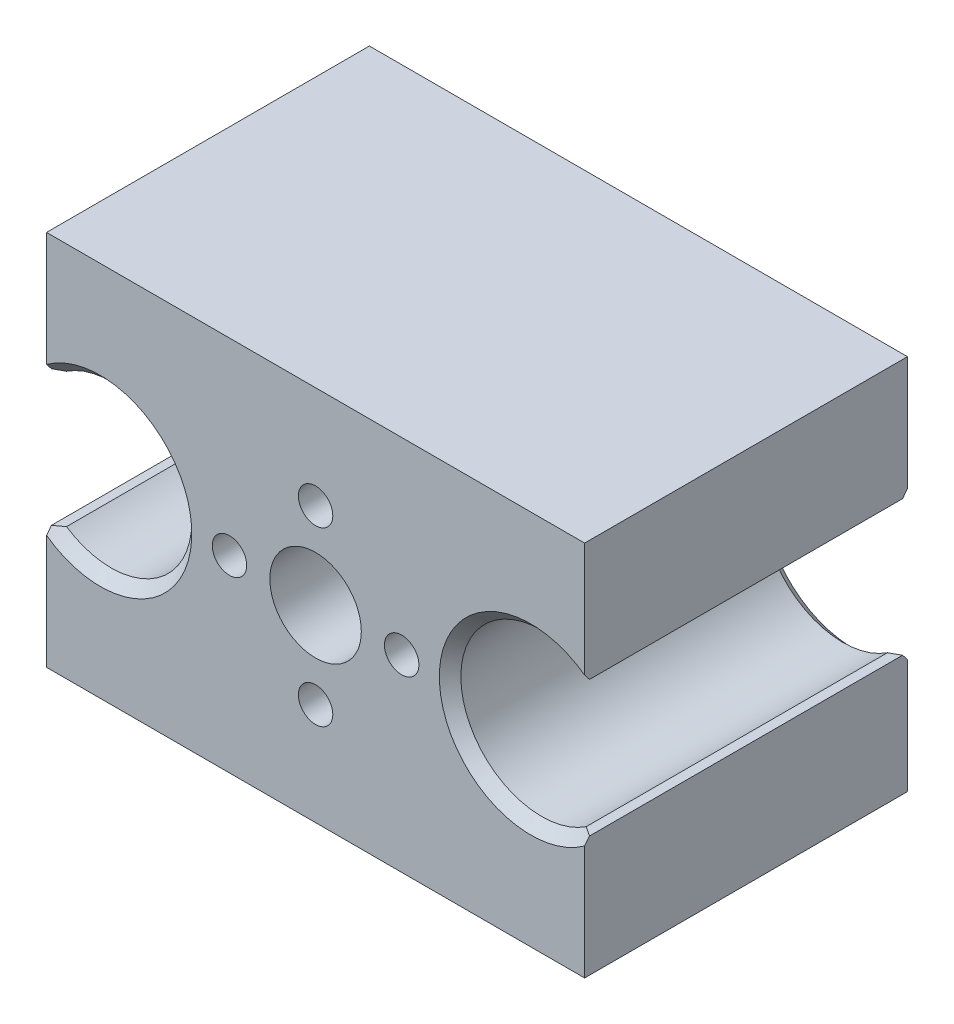
ISO-10303-21;
HEADER;
FILE_DESCRIPTION(('STEP AP214'),'2;1');
FILE_NAME('part.step','',(''),(''),'','','');
FILE_SCHEMA(('AUTOMOTIVE_DESIGN { 1 0 10303 214 1 1 1 1 }'));
ENDSEC;
DATA;
#1=APPLICATION_CONTEXT('core data for automotive mechanical design processes');
#2=APPLICATION_PROTOCOL_DEFINITION('international standard','automotive_design',2000,#1);
#3=PRODUCT_CONTEXT('',#1,'mechanical');
#4=PRODUCT('Part','Part','',(#3));
#5=PRODUCT_RELATED_PRODUCT_CATEGORY('part','',(#4));
#6=PRODUCT_DEFINITION_FORMATION('','',#4);
#7=PRODUCT_DEFINITION_CONTEXT('part definition',#1,'design');
#8=PRODUCT_DEFINITION('design','',#6,#7);
#9=PRODUCT_DEFINITION_SHAPE('','',#8);
#10=(LENGTH_UNIT() NAMED_UNIT(*) SI_UNIT(.MILLI.,.METRE.));
#11=(NAMED_UNIT(*) PLANE_ANGLE_UNIT() SI_UNIT($,.RADIAN.));
#12=(NAMED_UNIT(*) SI_UNIT($,.STERADIAN.) SOLID_ANGLE_UNIT());
#13=UNCERTAINTY_MEASURE_WITH_UNIT(LENGTH_MEASURE(1.E-05),#10,'distance_accuracy_value','');
#14=(GEOMETRIC_REPRESENTATION_CONTEXT(3) GLOBAL_UNCERTAINTY_ASSIGNED_CONTEXT((#13)) GLOBAL_UNIT_ASSIGNED_CONTEXT((#10,
#11,#12)) REPRESENTATION_CONTEXT('',''));
#15=CARTESIAN_POINT('',(0.,0.,0.));
#16=DIRECTION('',(0.,0.,1.));
#17=DIRECTION('',(1.,0.,0.));
#18=AXIS2_PLACEMENT_3D('',#15,#16,#17);
#19=CARTESIAN_POINT('',(25.,-17.5,30.));
#20=DIRECTION('',(-1.,0.,0.));
#21=DIRECTION('',(0.,0.,1.));
#22=AXIS2_PLACEMENT_3D('',#19,#20,#21);
#23=PLANE('',#22);
#24=DIRECTION('',(0.,0.,1.));
#25=VECTOR('',#24,1.);
#26=CARTESIAN_POINT('',(25.,-6.29837387624891,30.));
#27=LINE('',#26,#25);
#28=CARTESIAN_POINT('',(25.,-6.29837387624891,0.458264274112555));
#29=VERTEX_POINT('',#28);
#30=CARTESIAN_POINT('',(25.,-6.29837387624891,29.5417357258874));
#31=VERTEX_POINT('',#30);
#32=EDGE_CURVE('E178',#29,#31,#27,.T.);
#33=ORIENTED_EDGE('',*,*,#32,.T.);
#34=CARTESIAN_POINT('',(25.,-6.29837387624891,29.5417357258874));
#35=CARTESIAN_POINT('',(25.,-6.39488385614054,29.6173659402342));
#36=CARTESIAN_POINT('',(25.,-6.49109633830478,29.6933697531287));
#37=CARTESIAN_POINT('',(25.,-6.6829262265328,29.8461245117944));
#38=CARTESIAN_POINT('',(25.,-6.77854363309685,29.9228754569375));
#39=CARTESIAN_POINT('',(25.,-6.8738635424338,30.));
#40=B_SPLINE_CURVE_WITH_KNOTS('',3,(#34,#35,#36,#37,#38,#39),.UNSPECIFIED.,.F.,.F.,(4,2,4),(0.,
0.367832559309629,0.735664809344251),.UNSPECIFIED.);
#41=CARTESIAN_POINT('',(25.,-6.8738635424338,30.));
#42=VERTEX_POINT('',#41);
#43=EDGE_CURVE('E209',#31,#42,#40,.T.);
#44=ORIENTED_EDGE('',*,*,#43,.T.);
#45=DIRECTION('',(0.,1.,0.));
#46=VECTOR('',#45,1.);
#47=CARTESIAN_POINT('',(25.,-17.5,30.));
#48=LINE('',#47,#46);
#49=CARTESIAN_POINT('',(25.,-17.5,30.));
#50=VERTEX_POINT('',#49);
#51=EDGE_CURVE('E160',#50,#42,#48,.T.);
#52=ORIENTED_EDGE('',*,*,#51,.F.);
#53=DIRECTION('',(0.,0.,-1.));
#54=VECTOR('',#53,1.);
#55=CARTESIAN_POINT('',(25.,-17.5,30.));
#56=LINE('',#55,#54);
#57=CARTESIAN_POINT('',(25.,-17.5,0.));
#58=VERTEX_POINT('',#57);
#59=EDGE_CURVE('E421',#50,#58,#56,.T.);
#60=ORIENTED_EDGE('',*,*,#59,.T.);
#61=DIRECTION('',(0.,1.,0.));
#62=VECTOR('',#61,1.);
#63=CARTESIAN_POINT('',(25.,-17.5,0.));
#64=LINE('',#63,#62);
#65=CARTESIAN_POINT('',(25.,-6.87386354243378,0.));
#66=VERTEX_POINT('',#65);
#67=EDGE_CURVE('E424',#58,#66,#64,.T.);
#68=ORIENTED_EDGE('',*,*,#67,.T.);
#69=CARTESIAN_POINT('',(25.,-6.87386354243378,0.));
#70=CARTESIAN_POINT('',(25.,-6.77854363309684,0.0771245430624894));
#71=CARTESIAN_POINT('',(25.,-6.68292622653279,0.153875488205571));
#72=CARTESIAN_POINT('',(25.,-6.49109633830477,0.306630246871336));
#73=CARTESIAN_POINT('',(25.,-6.39488385614054,0.382634059765773));
#74=CARTESIAN_POINT('',(25.,-6.29837387624891,0.458264274112556));
#75=B_SPLINE_CURVE_WITH_KNOTS('',3,(#69,#70,#71,#72,#73,#74),.UNSPECIFIED.,.F.,.F.,(4,2,4),(0.,
0.367832250034613,0.735664809344231),.UNSPECIFIED.);
#76=EDGE_CURVE('E176',#66,#29,#75,.T.);
#77=ORIENTED_EDGE('',*,*,#76,.T.);
#78=EDGE_LOOP('',(#33,#44,#52,#60,#68,#77));
#79=FACE_BOUND('',#78,.T.);
#80=ADVANCED_FACE('F37',(#79),#23,.F.);
#81=CARTESIAN_POINT('',(0.,0.,30.));
#82=DIRECTION('',(0.,0.,-1.));
#83=DIRECTION('',(-1.,0.,0.));
#84=AXIS2_PLACEMENT_3D('',#81,#82,#83);
#85=PLANE('',#84);
#86=CARTESIAN_POINT('',(0.,0.,30.));
#87=DIRECTION('',(0.,0.,1.));
#88=DIRECTION('',(1.,0.,0.));
#89=AXIS2_PLACEMENT_3D('',#86,#87,#88);
#90=CIRCLE('',#89,4.25000000000001);
#91=CARTESIAN_POINT('',(4.25000000000001,0.,30.));
#92=VERTEX_POINT('',#91);
#93=EDGE_CURVE('E442',#92,#92,#90,.T.);
#94=ORIENTED_EDGE('',*,*,#93,.F.);
#95=EDGE_LOOP('',(#94));
#96=FACE_BOUND('',#95,.T.);
#97=CARTESIAN_POINT('',(0.,-8.,30.));
#98=DIRECTION('',(0.,0.,1.));
#99=DIRECTION('',(1.,0.,0.));
#100=AXIS2_PLACEMENT_3D('',#97,#98,#99);
#101=CIRCLE('',#100,1.60000000000001);
#102=CARTESIAN_POINT('',(1.60000000000001,-8.,30.));
#103=VERTEX_POINT('',#102);
#104=EDGE_CURVE('E449',#103,#103,#101,.T.);
#105=ORIENTED_EDGE('',*,*,#104,.F.);
#106=EDGE_LOOP('',(#105));
#107=FACE_BOUND('',#106,.T.);
#108=CARTESIAN_POINT('',(-8.,0.,30.));
#109=DIRECTION('',(0.,0.,1.));
#110=DIRECTION('',(1.,0.,0.));
#111=AXIS2_PLACEMENT_3D('',#108,#109,#110);
#112=CIRCLE('',#111,1.60000000000001);
#113=CARTESIAN_POINT('',(-6.39999999999999,0.,30.));
#114=VERTEX_POINT('',#113);
#115=EDGE_CURVE('E457',#114,#114,#112,.T.);
#116=ORIENTED_EDGE('',*,*,#115,.F.);
#117=EDGE_LOOP('',(#116));
#118=FACE_BOUND('',#117,.T.);
#119=CARTESIAN_POINT('',(0.,8.,30.));
#120=DIRECTION('',(0.,0.,1.));
#121=DIRECTION('',(1.,0.,0.));
#122=AXIS2_PLACEMENT_3D('',#119,#120,#121);
#123=CIRCLE('',#122,1.60000000000001);
#124=CARTESIAN_POINT('',(1.60000000000001,8.,30.));
#125=VERTEX_POINT('',#124);
#126=EDGE_CURVE('E463',#125,#125,#123,.T.);
#127=ORIENTED_EDGE('',*,*,#126,.F.);
#128=EDGE_LOOP('',(#127));
#129=FACE_BOUND('',#128,.T.);
#130=CARTESIAN_POINT('',(8.,0.,30.));
#131=DIRECTION('',(0.,0.,1.));
#132=DIRECTION('',(1.,0.,0.));
#133=AXIS2_PLACEMENT_3D('',#130,#131,#132);
#134=CIRCLE('',#133,1.60000000000001);
#135=CARTESIAN_POINT('',(9.60000000000002,0.,30.));
#136=VERTEX_POINT('',#135);
#137=EDGE_CURVE('E440',#136,#136,#134,.T.);
#138=ORIENTED_EDGE('',*,*,#137,.F.);
#139=EDGE_LOOP('',(#138));
#140=FACE_BOUND('',#139,.T.);
#141=ORIENTED_EDGE('',*,*,#51,.T.);
#142=CARTESIAN_POINT('',(20.,0.,30.));
#143=DIRECTION('',(0.,0.,-1.));
#144=DIRECTION('',(-1.,0.,0.));
#145=AXIS2_PLACEMENT_3D('',#142,#143,#144);
#146=CIRCLE('',#145,8.50000000000003);
#147=CARTESIAN_POINT('',(25.,6.8738635424338,30.));
#148=VERTEX_POINT('',#147);
#149=EDGE_CURVE('E156',#42,#148,#146,.T.);
#150=ORIENTED_EDGE('',*,*,#149,.T.);
#151=CARTESIAN_POINT('',(25.,17.5,30.));
#152=VERTEX_POINT('',#151);
#153=EDGE_CURVE('E148',#148,#152,#48,.T.);
#154=ORIENTED_EDGE('',*,*,#153,.T.);
#155=DIRECTION('',(-1.,0.,0.));
#156=VECTOR('',#155,1.);
#157=CARTESIAN_POINT('',(-25.,17.5,30.));
#158=LINE('',#157,#156);
#159=CARTESIAN_POINT('',(-25.,17.5,30.));
#160=VERTEX_POINT('',#159);
#161=EDGE_CURVE('E153',#152,#160,#158,.T.);
#162=ORIENTED_EDGE('',*,*,#161,.T.);
#163=DIRECTION('',(0.,-1.,0.));
#164=VECTOR('',#163,1.);
#165=CARTESIAN_POINT('',(-25.,-17.5,30.));
#166=LINE('',#165,#164);
#167=CARTESIAN_POINT('',(-25.,6.8738635424338,30.));
#168=VERTEX_POINT('',#167);
#169=EDGE_CURVE('E394',#160,#168,#166,.T.);
#170=ORIENTED_EDGE('',*,*,#169,.T.);
#171=CARTESIAN_POINT('',(-20.,0.,30.));
#172=DIRECTION('',(0.,0.,-1.));
#173=DIRECTION('',(-1.,0.,0.));
#174=AXIS2_PLACEMENT_3D('',#171,#172,#173);
#175=CIRCLE('',#174,8.50000000000003);
#176=CARTESIAN_POINT('',(-25.,-6.8738635424338,30.));
#177=VERTEX_POINT('',#176);
#178=EDGE_CURVE('E390',#168,#177,#175,.T.);
#179=ORIENTED_EDGE('',*,*,#178,.T.);
#180=CARTESIAN_POINT('',(-25.,-17.5,30.));
#181=VERTEX_POINT('',#180);
#182=EDGE_CURVE('E170',#177,#181,#166,.T.);
#183=ORIENTED_EDGE('',*,*,#182,.T.);
#184=DIRECTION('',(1.,0.,0.));
#185=VECTOR('',#184,1.);
#186=CARTESIAN_POINT('',(-25.,-17.5,30.));
#187=LINE('',#186,#185);
#188=EDGE_CURVE('E420',#181,#50,#187,.T.);
#189=ORIENTED_EDGE('',*,*,#188,.T.);
#190=EDGE_LOOP('',(#141,#150,#154,#162,#170,#179,#183,#189));
#191=FACE_BOUND('',#190,.T.);
#192=ADVANCED_FACE('F151',(#96,#107,#118,#129,#140,#191),#85,.F.);
#193=CARTESIAN_POINT('',(0.,0.,0.));
#194=DIRECTION('',(0.,0.,-1.));
#195=DIRECTION('',(-1.,0.,0.));
#196=AXIS2_PLACEMENT_3D('',#193,#194,#195);
#197=PLANE('',#196);
#198=CARTESIAN_POINT('',(0.,0.,0.));
#199=DIRECTION('',(0.,0.,-1.));
#200=DIRECTION('',(-1.,0.,0.));
#201=AXIS2_PLACEMENT_3D('',#198,#199,#200);
#202=CIRCLE('',#201,5.25000000000001);
#203=CARTESIAN_POINT('',(-5.25000000000001,0.,0.));
#204=VERTEX_POINT('',#203);
#205=EDGE_CURVE('E474',#204,#204,#202,.T.);
#206=ORIENTED_EDGE('',*,*,#205,.F.);
#207=EDGE_LOOP('',(#206));
#208=FACE_BOUND('',#207,.T.);
#209=CARTESIAN_POINT('',(8.,0.,0.));
#210=DIRECTION('',(0.,0.,1.));
#211=DIRECTION('',(1.,0.,0.));
#212=AXIS2_PLACEMENT_3D('',#209,#210,#211);
#213=CIRCLE('',#212,1.60000000000001);
#214=CARTESIAN_POINT('',(9.60000000000001,0.,0.));
#215=VERTEX_POINT('',#214);
#216=EDGE_CURVE('E466',#215,#215,#213,.T.);
#217=ORIENTED_EDGE('',*,*,#216,.T.);
#218=EDGE_LOOP('',(#217));
#219=FACE_BOUND('',#218,.T.);
#220=CARTESIAN_POINT('',(0.,8.,0.));
#221=DIRECTION('',(0.,0.,1.));
#222=DIRECTION('',(1.,0.,0.));
#223=AXIS2_PLACEMENT_3D('',#220,#221,#222);
#224=CIRCLE('',#223,1.60000000000001);
#225=CARTESIAN_POINT('',(1.60000000000001,8.,0.));
#226=VERTEX_POINT('',#225);
#227=EDGE_CURVE('E460',#226,#226,#224,.T.);
#228=ORIENTED_EDGE('',*,*,#227,.T.);
#229=EDGE_LOOP('',(#228));
#230=FACE_BOUND('',#229,.T.);
#231=CARTESIAN_POINT('',(-8.,0.,0.));
#232=DIRECTION('',(0.,0.,1.));
#233=DIRECTION('',(1.,0.,0.));
#234=AXIS2_PLACEMENT_3D('',#231,#232,#233);
#235=CIRCLE('',#234,1.60000000000001);
#236=CARTESIAN_POINT('',(-6.39999999999999,0.,0.));
#237=VERTEX_POINT('',#236);
#238=EDGE_CURVE('E454',#237,#237,#235,.T.);
#239=ORIENTED_EDGE('',*,*,#238,.T.);
#240=EDGE_LOOP('',(#239));
#241=FACE_BOUND('',#240,.T.);
#242=CARTESIAN_POINT('',(0.,-8.,0.));
#243=DIRECTION('',(0.,0.,1.));
#244=DIRECTION('',(1.,0.,0.));
#245=AXIS2_PLACEMENT_3D('',#242,#243,#244);
#246=CIRCLE('',#245,1.60000000000001);
#247=CARTESIAN_POINT('',(1.60000000000001,-8.,0.));
#248=VERTEX_POINT('',#247);
#249=EDGE_CURVE('E444',#248,#248,#246,.T.);
#250=ORIENTED_EDGE('',*,*,#249,.T.);
#251=EDGE_LOOP('',(#250));
#252=FACE_BOUND('',#251,.T.);
#253=CARTESIAN_POINT('',(25.,6.87386354243378,0.));
#254=VERTEX_POINT('',#253);
#255=CARTESIAN_POINT('',(25.,17.5,0.));
#256=VERTEX_POINT('',#255);
#257=EDGE_CURVE('E174',#254,#256,#64,.T.);
#258=ORIENTED_EDGE('',*,*,#257,.F.);
#259=CARTESIAN_POINT('',(20.,0.,0.));
#260=DIRECTION('',(0.,0.,-1.));
#261=DIRECTION('',(-1.,0.,0.));
#262=AXIS2_PLACEMENT_3D('',#259,#260,#261);
#263=CIRCLE('',#262,8.50000000000002);
#264=EDGE_CURVE('E234',#254,#66,#263,.F.);
#265=ORIENTED_EDGE('',*,*,#264,.T.);
#266=ORIENTED_EDGE('',*,*,#67,.F.);
#267=DIRECTION('',(1.,0.,0.));
#268=VECTOR('',#267,1.);
#269=CARTESIAN_POINT('',(-25.,-17.5,0.));
#270=LINE('',#269,#268);
#271=CARTESIAN_POINT('',(-25.,-17.5,0.));
#272=VERTEX_POINT('',#271);
#273=EDGE_CURVE('E161',#272,#58,#270,.T.);
#274=ORIENTED_EDGE('',*,*,#273,.F.);
#275=DIRECTION('',(0.,-1.,0.));
#276=VECTOR('',#275,1.);
#277=CARTESIAN_POINT('',(-25.,-17.5,0.));
#278=LINE('',#277,#276);
#279=CARTESIAN_POINT('',(-25.,-6.87386354243378,0.));
#280=VERTEX_POINT('',#279);
#281=EDGE_CURVE('E407',#280,#272,#278,.T.);
#282=ORIENTED_EDGE('',*,*,#281,.F.);
#283=CARTESIAN_POINT('',(-20.,0.,0.));
#284=DIRECTION('',(0.,0.,-1.));
#285=DIRECTION('',(-1.,0.,0.));
#286=AXIS2_PLACEMENT_3D('',#283,#284,#285);
#287=CIRCLE('',#286,8.50000000000002);
#288=CARTESIAN_POINT('',(-25.,6.87386354243378,0.));
#289=VERTEX_POINT('',#288);
#290=EDGE_CURVE('E231',#280,#289,#287,.F.);
#291=ORIENTED_EDGE('',*,*,#290,.T.);
#292=CARTESIAN_POINT('',(-25.,17.5,0.));
#293=VERTEX_POINT('',#292);
#294=EDGE_CURVE('E413',#293,#289,#278,.T.);
#295=ORIENTED_EDGE('',*,*,#294,.F.);
#296=DIRECTION('',(-1.,0.,0.));
#297=VECTOR('',#296,1.);
#298=CARTESIAN_POINT('',(-25.,17.5,0.));
#299=LINE('',#298,#297);
#300=EDGE_CURVE('E414',#256,#293,#299,.T.);
#301=ORIENTED_EDGE('',*,*,#300,.F.);
#302=EDGE_LOOP('',(#258,#265,#266,#274,#282,#291,#295,#301));
#303=FACE_BOUND('',#302,.T.);
#304=ADVANCED_FACE('F373',(#208,#219,#230,#241,#252,#303),#197,.T.);
#305=CARTESIAN_POINT('',(-25.,-17.5,30.));
#306=DIRECTION('',(1.,0.,0.));
#307=DIRECTION('',(0.,0.,-1.));
#308=AXIS2_PLACEMENT_3D('',#305,#306,#307);
#309=PLANE('',#308);
#310=ORIENTED_EDGE('',*,*,#294,.T.);
#311=CARTESIAN_POINT('',(-25.,6.87386354243378,0.));
#312=CARTESIAN_POINT('',(-25.,6.77854363309684,0.0771245430624881));
#313=CARTESIAN_POINT('',(-25.,6.68292622653279,0.153875488205569));
#314=CARTESIAN_POINT('',(-25.,6.49109633830477,0.306630246871331));
#315=CARTESIAN_POINT('',(-25.,6.39488385614054,0.382634059765766));
#316=CARTESIAN_POINT('',(-25.,6.29837387624891,0.458264274112548));
#317=B_SPLINE_CURVE_WITH_KNOTS('',3,(#311,#312,#313,#314,#315,#316),.UNSPECIFIED.,.F.,.F.,(4,2,
4),(0.,0.36783225003461,0.735664809344226),.UNSPECIFIED.);
#318=CARTESIAN_POINT('',(-25.,6.29837387624891,0.458264274112549));
#319=VERTEX_POINT('',#318);
#320=EDGE_CURVE('E11',#289,#319,#317,.T.);
#321=ORIENTED_EDGE('',*,*,#320,.T.);
#322=DIRECTION('',(0.,0.,1.));
#323=VECTOR('',#322,1.);
#324=CARTESIAN_POINT('',(-25.,6.29837387624891,30.));
#325=LINE('',#324,#323);
#326=CARTESIAN_POINT('',(-25.,6.29837387624891,29.5417357258874));
#327=VERTEX_POINT('',#326);
#328=EDGE_CURVE('E48',#319,#327,#325,.T.);
#329=ORIENTED_EDGE('',*,*,#328,.T.);
#330=CARTESIAN_POINT('',(-25.,6.29837387624891,29.5417357258874));
#331=CARTESIAN_POINT('',(-25.,6.39488385614054,29.6173659402342));
#332=CARTESIAN_POINT('',(-25.,6.49109633830478,29.6933697531287));
#333=CARTESIAN_POINT('',(-25.,6.6829262265328,29.8461245117944));
#334=CARTESIAN_POINT('',(-25.,6.77854363309685,29.9228754569375));
#335=CARTESIAN_POINT('',(-25.,6.8738635424338,30.));
#336=B_SPLINE_CURVE_WITH_KNOTS('',3,(#330,#331,#332,#333,#334,#335),.UNSPECIFIED.,.F.,.F.,(4,2,
4),(0.,0.367832559309628,0.735664809344249),.UNSPECIFIED.);
#337=EDGE_CURVE('E270',#327,#168,#336,.T.);
#338=ORIENTED_EDGE('',*,*,#337,.T.);
#339=ORIENTED_EDGE('',*,*,#169,.F.);
#340=DIRECTION('',(0.,0.,-1.));
#341=VECTOR('',#340,1.);
#342=CARTESIAN_POINT('',(-25.,17.5,30.));
#343=LINE('',#342,#341);
#344=EDGE_CURVE('E168',#160,#293,#343,.T.);
#345=ORIENTED_EDGE('',*,*,#344,.T.);
#346=EDGE_LOOP('',(#310,#321,#329,#338,#339,#345));
#347=FACE_BOUND('',#346,.T.);
#348=ADVANCED_FACE('F200',(#347),#309,.F.);
#349=ORIENTED_EDGE('',*,*,#153,.F.);
#350=CARTESIAN_POINT('',(25.,6.8738635424338,30.));
#351=CARTESIAN_POINT('',(25.,6.77854363309685,29.9228754569375));
#352=CARTESIAN_POINT('',(25.,6.6829262265328,29.8461245117944));
#353=CARTESIAN_POINT('',(25.,6.49109633830478,29.6933697531287));
#354=CARTESIAN_POINT('',(25.,6.39488385614054,29.6173659402342));
#355=CARTESIAN_POINT('',(25.,6.29837387624891,29.5417357258874));
#356=B_SPLINE_CURVE_WITH_KNOTS('',3,(#350,#351,#352,#353,#354,#355),.UNSPECIFIED.,.F.,.F.,(4,2,
4),(0.,0.367832250034623,0.73566480934425),.UNSPECIFIED.);
#357=CARTESIAN_POINT('',(25.,6.29837387624891,29.5417357258874));
#358=VERTEX_POINT('',#357);
#359=EDGE_CURVE('E225',#148,#358,#356,.T.);
#360=ORIENTED_EDGE('',*,*,#359,.T.);
#361=DIRECTION('',(0.,0.,-1.));
#362=VECTOR('',#361,1.);
#363=CARTESIAN_POINT('',(25.,6.29837387624891,30.));
#364=LINE('',#363,#362);
#365=CARTESIAN_POINT('',(25.,6.29837387624891,0.458264274112555));
#366=VERTEX_POINT('',#365);
#367=EDGE_CURVE('E223',#358,#366,#364,.T.);
#368=ORIENTED_EDGE('',*,*,#367,.T.);
#369=CARTESIAN_POINT('',(25.,6.29837387624891,0.458264274112555));
#370=CARTESIAN_POINT('',(25.,6.39488385614054,0.382634059765772));
#371=CARTESIAN_POINT('',(25.,6.49109633830477,0.306630246871336));
#372=CARTESIAN_POINT('',(25.,6.68292622653279,0.153875488205572));
#373=CARTESIAN_POINT('',(25.,6.77854363309684,0.0771245430624909));
#374=CARTESIAN_POINT('',(25.,6.87386354243378,0.));
#375=B_SPLINE_CURVE_WITH_KNOTS('',3,(#369,#370,#371,#372,#373,#374),.UNSPECIFIED.,.F.,.F.,(4,2,
4),(0.,0.367832559309616,0.735664809344228),.UNSPECIFIED.);
#376=EDGE_CURVE('E216',#366,#254,#375,.T.);
#377=ORIENTED_EDGE('',*,*,#376,.T.);
#378=ORIENTED_EDGE('',*,*,#257,.T.);
#379=DIRECTION('',(0.,0.,-1.));
#380=VECTOR('',#379,1.);
#381=CARTESIAN_POINT('',(25.,17.5,30.));
#382=LINE('',#381,#380);
#383=EDGE_CURVE('E166',#152,#256,#382,.T.);
#384=ORIENTED_EDGE('',*,*,#383,.F.);
#385=EDGE_LOOP('',(#349,#360,#368,#377,#378,#384));
#386=FACE_BOUND('',#385,.T.);
#387=ADVANCED_FACE('F172',(#386),#23,.F.);
#388=CARTESIAN_POINT('',(-25.,17.5,30.));
#389=DIRECTION('',(0.,-1.,0.));
#390=DIRECTION('',(0.,0.,-1.));
#391=AXIS2_PLACEMENT_3D('',#388,#389,#390);
#392=PLANE('',#391);
#393=ORIENTED_EDGE('',*,*,#300,.T.);
#394=ORIENTED_EDGE('',*,*,#344,.F.);
#395=ORIENTED_EDGE('',*,*,#161,.F.);
#396=ORIENTED_EDGE('',*,*,#383,.T.);
#397=EDGE_LOOP('',(#393,#394,#395,#396));
#398=FACE_BOUND('',#397,.T.);
#399=ADVANCED_FACE('F165',(#398),#392,.F.);
#400=DIRECTION('',(0.,0.,-1.));
#401=VECTOR('',#400,1.);
#402=CARTESIAN_POINT('',(-25.,-6.29837387624891,30.));
#403=LINE('',#402,#401);
#404=CARTESIAN_POINT('',(-25.,-6.29837387624891,29.5417357258874));
#405=VERTEX_POINT('',#404);
#406=CARTESIAN_POINT('',(-25.,-6.29837387624891,0.458264274112549));
#407=VERTEX_POINT('',#406);
#408=EDGE_CURVE('E251',#405,#407,#403,.T.);
#409=ORIENTED_EDGE('',*,*,#408,.T.);
#410=CARTESIAN_POINT('',(-25.,-6.29837387624891,0.458264274112549));
#411=CARTESIAN_POINT('',(-25.,-6.39488385614054,0.382634059765766));
#412=CARTESIAN_POINT('',(-25.,-6.49109633830477,0.30663024687133));
#413=CARTESIAN_POINT('',(-25.,-6.68292622653279,0.153875488205569));
#414=CARTESIAN_POINT('',(-25.,-6.77854363309684,0.0771245430624885));
#415=CARTESIAN_POINT('',(-25.,-6.87386354243378,0.));
#416=B_SPLINE_CURVE_WITH_KNOTS('',3,(#410,#411,#412,#413,#414,#415),.UNSPECIFIED.,.F.,.F.,(4,2,
4),(0.,0.367832559309616,0.735664809344226),.UNSPECIFIED.);
#417=EDGE_CURVE('E263',#407,#280,#416,.T.);
#418=ORIENTED_EDGE('',*,*,#417,.T.);
#419=ORIENTED_EDGE('',*,*,#281,.T.);
#420=DIRECTION('',(0.,0.,-1.));
#421=VECTOR('',#420,1.);
#422=CARTESIAN_POINT('',(-25.,-17.5,30.));
#423=LINE('',#422,#421);
#424=EDGE_CURVE('E180',#181,#272,#423,.T.);
#425=ORIENTED_EDGE('',*,*,#424,.F.);
#426=ORIENTED_EDGE('',*,*,#182,.F.);
#427=CARTESIAN_POINT('',(-25.,-6.8738635424338,30.));
#428=CARTESIAN_POINT('',(-25.,-6.77854363309685,29.9228754569375));
#429=CARTESIAN_POINT('',(-25.,-6.6829262265328,29.8461245117944));
#430=CARTESIAN_POINT('',(-25.,-6.49109633830478,29.6933697531287));
#431=CARTESIAN_POINT('',(-25.,-6.39488385614054,29.6173659402342));
#432=CARTESIAN_POINT('',(-25.,-6.29837387624891,29.5417357258874));
#433=B_SPLINE_CURVE_WITH_KNOTS('',3,(#427,#428,#429,#430,#431,#432),.UNSPECIFIED.,.F.,.F.,(4,2,
4),(0.,0.367832250034623,0.73566480934425),.UNSPECIFIED.);
#434=EDGE_CURVE('E245',#177,#405,#433,.T.);
#435=ORIENTED_EDGE('',*,*,#434,.T.);
#436=EDGE_LOOP('',(#409,#418,#419,#425,#426,#435));
#437=FACE_BOUND('',#436,.T.);
#438=ADVANCED_FACE('F253',(#437),#309,.F.);
#439=CARTESIAN_POINT('',(-25.,-17.5,30.));
#440=DIRECTION('',(0.,1.,0.));
#441=DIRECTION('',(0.,0.,1.));
#442=AXIS2_PLACEMENT_3D('',#439,#440,#441);
#443=PLANE('',#442);
#444=ORIENTED_EDGE('',*,*,#273,.T.);
#445=ORIENTED_EDGE('',*,*,#59,.F.);
#446=ORIENTED_EDGE('',*,*,#188,.F.);
#447=ORIENTED_EDGE('',*,*,#424,.T.);
#448=EDGE_LOOP('',(#444,#445,#446,#447));
#449=FACE_BOUND('',#448,.T.);
#450=ADVANCED_FACE('F257',(#449),#443,.F.);
#451=CARTESIAN_POINT('',(0.,0.,30.));
#452=DIRECTION('',(0.,0.,1.));
#453=DIRECTION('',(1.,0.,0.));
#454=AXIS2_PLACEMENT_3D('',#451,#452,#453);
#455=CYLINDRICAL_SURFACE('',#454,4.25000000000001);
#456=CARTESIAN_POINT('',(0.,0.,12.));
#457=DIRECTION('',(0.,0.,1.));
#458=DIRECTION('',(1.,0.,0.));
#459=AXIS2_PLACEMENT_3D('',#456,#457,#458);
#460=CIRCLE('',#459,4.25000000000001);
#461=CARTESIAN_POINT('',(4.25000000000001,0.,12.));
#462=VERTEX_POINT('',#461);
#463=EDGE_CURVE('E43',#462,#462,#460,.F.);
#464=ORIENTED_EDGE('',*,*,#463,.T.);
#465=EDGE_LOOP('',(#464));
#466=FACE_BOUND('',#465,.T.);
#467=ORIENTED_EDGE('',*,*,#93,.T.);
#468=EDGE_LOOP('',(#467));
#469=FACE_BOUND('',#468,.T.);
#470=ADVANCED_FACE('F494',(#466,#469),#455,.F.);
#471=CARTESIAN_POINT('',(0.,-8.,30.));
#472=DIRECTION('',(0.,0.,1.));
#473=DIRECTION('',(1.,0.,0.));
#474=AXIS2_PLACEMENT_3D('',#471,#472,#473);
#475=CYLINDRICAL_SURFACE('',#474,1.60000000000001);
#476=ORIENTED_EDGE('',*,*,#249,.F.);
#477=EDGE_LOOP('',(#476));
#478=FACE_BOUND('',#477,.T.);
#479=ORIENTED_EDGE('',*,*,#104,.T.);
#480=EDGE_LOOP('',(#479));
#481=FACE_BOUND('',#480,.T.);
#482=ADVANCED_FACE('F490',(#478,#481),#475,.F.);
#483=CARTESIAN_POINT('',(-8.,0.,30.));
#484=DIRECTION('',(0.,0.,1.));
#485=DIRECTION('',(1.,0.,0.));
#486=AXIS2_PLACEMENT_3D('',#483,#484,#485);
#487=CYLINDRICAL_SURFACE('',#486,1.60000000000001);
#488=ORIENTED_EDGE('',*,*,#238,.F.);
#489=EDGE_LOOP('',(#488));
#490=FACE_BOUND('',#489,.T.);
#491=ORIENTED_EDGE('',*,*,#115,.T.);
#492=EDGE_LOOP('',(#491));
#493=FACE_BOUND('',#492,.T.);
#494=ADVANCED_FACE('F493',(#490,#493),#487,.F.);
#495=CARTESIAN_POINT('',(0.,8.,30.));
#496=DIRECTION('',(0.,0.,1.));
#497=DIRECTION('',(1.,0.,0.));
#498=AXIS2_PLACEMENT_3D('',#495,#496,#497);
#499=CYLINDRICAL_SURFACE('',#498,1.60000000000001);
#500=ORIENTED_EDGE('',*,*,#227,.F.);
#501=EDGE_LOOP('',(#500));
#502=FACE_BOUND('',#501,.T.);
#503=ORIENTED_EDGE('',*,*,#126,.T.);
#504=EDGE_LOOP('',(#503));
#505=FACE_BOUND('',#504,.T.);
#506=ADVANCED_FACE('F507',(#502,#505),#499,.F.);
#507=CARTESIAN_POINT('',(8.,0.,30.));
#508=DIRECTION('',(0.,0.,1.));
#509=DIRECTION('',(1.,0.,0.));
#510=AXIS2_PLACEMENT_3D('',#507,#508,#509);
#511=CYLINDRICAL_SURFACE('',#510,1.60000000000001);
#512=ORIENTED_EDGE('',*,*,#216,.F.);
#513=EDGE_LOOP('',(#512));
#514=FACE_BOUND('',#513,.T.);
#515=ORIENTED_EDGE('',*,*,#137,.T.);
#516=EDGE_LOOP('',(#515));
#517=FACE_BOUND('',#516,.T.);
#518=ADVANCED_FACE('F505',(#514,#517),#511,.F.);
#519=CARTESIAN_POINT('',(-20.,0.,30.));
#520=DIRECTION('',(0.,0.,1.));
#521=DIRECTION('',(1.,0.,0.));
#522=AXIS2_PLACEMENT_3D('',#519,#520,#521);
#523=CYLINDRICAL_SURFACE('',#522,7.50000000000001);
#524=DIRECTION('',(0.,0.,1.));
#525=VECTOR('',#524,1.);
#526=CARTESIAN_POINT('',(-24.1447101151354,6.25071020456831,30.));
#527=LINE('',#526,#525);
#528=CARTESIAN_POINT('',(-24.1447101151354,6.25071020456831,29.));
#529=VERTEX_POINT('',#528);
#530=CARTESIAN_POINT('',(-24.1447101151354,6.25071020456831,0.999999999999994));
#531=VERTEX_POINT('',#530);
#532=EDGE_CURVE('E240',#529,#531,#527,.F.);
#533=ORIENTED_EDGE('',*,*,#532,.T.);
#534=CARTESIAN_POINT('',(-20.,0.,0.999999999999994));
#535=DIRECTION('',(0.,0.,-1.));
#536=DIRECTION('',(-1.,0.,0.));
#537=AXIS2_PLACEMENT_3D('',#534,#535,#536);
#538=CIRCLE('',#537,7.50000000000001);
#539=CARTESIAN_POINT('',(-24.1447101151354,-6.25071020456831,0.999999999999994));
#540=VERTEX_POINT('',#539);
#541=EDGE_CURVE('E242',#531,#540,#538,.T.);
#542=ORIENTED_EDGE('',*,*,#541,.T.);
#543=DIRECTION('',(0.,0.,1.));
#544=VECTOR('',#543,1.);
#545=CARTESIAN_POINT('',(-24.1447101151354,-6.25071020456831,30.));
#546=LINE('',#545,#544);
#547=CARTESIAN_POINT('',(-24.1447101151354,-6.25071020456831,29.));
#548=VERTEX_POINT('',#547);
#549=EDGE_CURVE('E238',#540,#548,#546,.T.);
#550=ORIENTED_EDGE('',*,*,#549,.T.);
#551=CARTESIAN_POINT('',(-20.,0.,29.));
#552=DIRECTION('',(0.,0.,-1.));
#553=DIRECTION('',(-1.,0.,0.));
#554=AXIS2_PLACEMENT_3D('',#551,#552,#553);
#555=CIRCLE('',#554,7.50000000000001);
#556=EDGE_CURVE('E236',#548,#529,#555,.F.);
#557=ORIENTED_EDGE('',*,*,#556,.T.);
#558=EDGE_LOOP('',(#533,#542,#550,#557));
#559=FACE_BOUND('',#558,.T.);
#560=ADVANCED_FACE('F419',(#559),#523,.F.);
#561=CARTESIAN_POINT('',(20.,0.,30.));
#562=DIRECTION('',(0.,0.,1.));
#563=DIRECTION('',(1.,0.,0.));
#564=AXIS2_PLACEMENT_3D('',#561,#562,#563);
#565=CYLINDRICAL_SURFACE('',#564,7.50000000000001);
#566=CARTESIAN_POINT('',(20.,0.,29.));
#567=DIRECTION('',(0.,0.,-1.));
#568=DIRECTION('',(-1.,0.,0.));
#569=AXIS2_PLACEMENT_3D('',#566,#567,#568);
#570=CIRCLE('',#569,7.50000000000001);
#571=CARTESIAN_POINT('',(24.1447101151354,6.25071020456831,29.));
#572=VERTEX_POINT('',#571);
#573=CARTESIAN_POINT('',(24.1447101151354,-6.25071020456831,29.));
#574=VERTEX_POINT('',#573);
#575=EDGE_CURVE('E385',#572,#574,#570,.F.);
#576=ORIENTED_EDGE('',*,*,#575,.T.);
#577=DIRECTION('',(0.,0.,1.));
#578=VECTOR('',#577,1.);
#579=CARTESIAN_POINT('',(24.1447101151354,-6.25071020456831,30.));
#580=LINE('',#579,#578);
#581=CARTESIAN_POINT('',(24.1447101151354,-6.25071020456831,1.00000000000001));
#582=VERTEX_POINT('',#581);
#583=EDGE_CURVE('E389',#574,#582,#580,.F.);
#584=ORIENTED_EDGE('',*,*,#583,.T.);
#585=CARTESIAN_POINT('',(20.,0.,1.00000000000001));
#586=DIRECTION('',(0.,0.,-1.));
#587=DIRECTION('',(-1.,0.,0.));
#588=AXIS2_PLACEMENT_3D('',#585,#586,#587);
#589=CIRCLE('',#588,7.50000000000001);
#590=CARTESIAN_POINT('',(24.1447101151354,6.25071020456831,1.00000000000001));
#591=VERTEX_POINT('',#590);
#592=EDGE_CURVE('E380',#582,#591,#589,.T.);
#593=ORIENTED_EDGE('',*,*,#592,.T.);
#594=DIRECTION('',(0.,0.,1.));
#595=VECTOR('',#594,1.);
#596=CARTESIAN_POINT('',(24.1447101151354,6.25071020456831,30.));
#597=LINE('',#596,#595);
#598=EDGE_CURVE('E381',#591,#572,#597,.T.);
#599=ORIENTED_EDGE('',*,*,#598,.T.);
#600=EDGE_LOOP('',(#576,#584,#593,#599));
#601=FACE_BOUND('',#600,.T.);
#602=ADVANCED_FACE('F514',(#601),#565,.F.);
#603=CARTESIAN_POINT('',(25.,6.29837387624891,30.));
#604=DIRECTION('',(0.0556417559037672,-0.998450797485758,0.));
#605=DIRECTION('',(0.,0.,1.));
#606=AXIS2_PLACEMENT_3D('',#603,#604,#605);
#607=PLANE('',#606);
#608=CARTESIAN_POINT('',(25.,6.29837387624891,29.5417357258874));
#609=CARTESIAN_POINT('',(24.9297469400284,6.29445880739998,29.4949902781776));
#610=CARTESIAN_POINT('',(24.8592569166312,6.29053053303193,29.4486006938272));
#611=CARTESIAN_POINT('',(24.7177838918034,6.28264651157162,29.3566038804387));
#612=CARTESIAN_POINT('',(24.6468009605939,6.27869076839266,29.3109965430462));
#613=CARTESIAN_POINT('',(24.5043023976615,6.27074959565256,29.2206210843675));
#614=CARTESIAN_POINT('',(24.4327867579904,6.26676416564849,29.1758529756381));
#615=CARTESIAN_POINT('',(24.2891830542685,6.25876140552301,29.0872249653439));
#616=CARTESIAN_POINT('',(24.2170949116467,6.25474407102299,29.0433651915278));
#617=CARTESIAN_POINT('',(24.1447101151354,6.25071020456831,29.));
#618=B_SPLINE_CURVE_WITH_KNOTS('',3,(#608,#609,#610,#611,#612,#613,#614,#615,#616,#617),
.UNSPECIFIED.,.F.,.F.,(4,2,2,2,4),(0.,0.253423790157961,0.506812188638805,0.760204375345846,
1.0136319605022),.UNSPECIFIED.);
#619=EDGE_CURVE('E341',#572,#358,#618,.F.);
#620=ORIENTED_EDGE('',*,*,#619,.F.);
#621=ORIENTED_EDGE('',*,*,#598,.F.);
#622=CARTESIAN_POINT('',(25.,6.29837387624891,0.458264274112557));
#623=CARTESIAN_POINT('',(24.9297469400284,6.29445880739998,0.505009721822358));
#624=CARTESIAN_POINT('',(24.8592569166312,6.29053053303193,0.551399306172786));
#625=CARTESIAN_POINT('',(24.7177838918034,6.28264651157162,0.643396119561309));
#626=CARTESIAN_POINT('',(24.6468009605939,6.27869076839266,0.689003456953799));
#627=CARTESIAN_POINT('',(24.5043023976615,6.27074959565256,0.77937891563245));
#628=CARTESIAN_POINT('',(24.4327867579904,6.26676416564849,0.824147024361905));
#629=CARTESIAN_POINT('',(24.2891830542685,6.25876140552301,0.912775034656092));
#630=CARTESIAN_POINT('',(24.2170949116467,6.25474407102299,0.95663480847218));
#631=CARTESIAN_POINT('',(24.1447101151354,6.25071020456831,1.00000000000001));
#632=B_SPLINE_CURVE_WITH_KNOTS('',3,(#622,#623,#624,#625,#626,#627,#628,#629,#630,#631),
.UNSPECIFIED.,.F.,.F.,(4,2,2,2,4),(0.,0.253423790157962,0.506812188638806,0.760204375345845,
1.0136319605022),.UNSPECIFIED.);
#633=EDGE_CURVE('E345',#366,#591,#632,.T.);
#634=ORIENTED_EDGE('',*,*,#633,.F.);
#635=ORIENTED_EDGE('',*,*,#367,.F.);
#636=EDGE_LOOP('',(#620,#621,#634,#635));
#637=FACE_BOUND('',#636,.T.);
#638=ADVANCED_FACE('F436',(#637),#607,.T.);
#639=CARTESIAN_POINT('',(20.,0.,0.));
#640=DIRECTION('',(0.,0.,-1.));
#641=DIRECTION('',(-1.,0.,0.));
#642=AXIS2_PLACEMENT_3D('',#639,#640,#641);
#643=CONICAL_SURFACE('',#642,8.50000000000002,0.785398163397445);
#644=ORIENTED_EDGE('',*,*,#633,.T.);
#645=ORIENTED_EDGE('',*,*,#592,.F.);
#646=CARTESIAN_POINT('',(24.1447101151354,-6.25071020456831,1.00000000000001));
#647=CARTESIAN_POINT('',(24.2170949116467,-6.25474407102298,0.956634808472176));
#648=CARTESIAN_POINT('',(24.2891830542685,-6.25876140552301,0.91277503465609));
#649=CARTESIAN_POINT('',(24.4327867579904,-6.26676416564849,0.824147024361907));
#650=CARTESIAN_POINT('',(24.5043023976615,-6.27074959565256,0.779378915632455));
#651=CARTESIAN_POINT('',(24.6468009605939,-6.27869076839265,0.689003456953796));
#652=CARTESIAN_POINT('',(24.7177838918034,-6.28264651157162,0.643396119561296));
#653=CARTESIAN_POINT('',(24.8592569166312,-6.29053053303193,0.551399306172803));
#654=CARTESIAN_POINT('',(24.9297469400284,-6.29445880739998,0.505009721822415));
#655=CARTESIAN_POINT('',(25.0000000000001,-6.29837387624892,0.45826427411271));
#656=B_SPLINE_CURVE_WITH_KNOTS('',3,(#646,#647,#648,#649,#650,#651,#652,#653,#654,#655),
.UNSPECIFIED.,.F.,.F.,(4,2,2,2,4),(0.,0.253427585156351,0.50681977186339,0.760208170344233,
1.01363196050218),.UNSPECIFIED.);
#657=EDGE_CURVE('E335',#29,#582,#656,.F.);
#658=ORIENTED_EDGE('',*,*,#657,.F.);
#659=ORIENTED_EDGE('',*,*,#76,.F.);
#660=ORIENTED_EDGE('',*,*,#264,.F.);
#661=ORIENTED_EDGE('',*,*,#376,.F.);
#662=EDGE_LOOP('',(#644,#645,#658,#659,#660,#661));
#663=FACE_BOUND('',#662,.T.);
#664=ADVANCED_FACE('F192',(#663),#643,.F.);
#665=CARTESIAN_POINT('',(20.,0.,29.));
#666=DIRECTION('',(0.,0.,1.));
#667=DIRECTION('',(1.,0.,0.));
#668=AXIS2_PLACEMENT_3D('',#665,#666,#667);
#669=CONICAL_SURFACE('',#668,7.50000000000001,0.78539816339745);
#670=ORIENTED_EDGE('',*,*,#149,.F.);
#671=ORIENTED_EDGE('',*,*,#43,.F.);
#672=CARTESIAN_POINT('',(25.,-6.29837387624891,29.5417357258874));
#673=CARTESIAN_POINT('',(24.9297469400284,-6.29445880739997,29.4949902781776));
#674=CARTESIAN_POINT('',(24.8592569166312,-6.29053053303193,29.4486006938272));
#675=CARTESIAN_POINT('',(24.7177838918034,-6.28264651157162,29.3566038804387));
#676=CARTESIAN_POINT('',(24.6468009605939,-6.27869076839265,29.3109965430462));
#677=CARTESIAN_POINT('',(24.5043023976615,-6.27074959565256,29.2206210843675));
#678=CARTESIAN_POINT('',(24.4327867579904,-6.26676416564849,29.1758529756381));
#679=CARTESIAN_POINT('',(24.2891830542685,-6.25876140552301,29.0872249653439));
#680=CARTESIAN_POINT('',(24.2170949116467,-6.25474407102298,29.0433651915278));
#681=CARTESIAN_POINT('',(24.1447101151354,-6.25071020456831,29.));
#682=B_SPLINE_CURVE_WITH_KNOTS('',3,(#672,#673,#674,#675,#676,#677,#678,#679,#680,#681),
.UNSPECIFIED.,.F.,.F.,(4,2,2,2,4),(0.,0.253423790157958,0.506812188638802,0.76020437534584,
1.01363196050219),.UNSPECIFIED.);
#683=EDGE_CURVE('E281',#574,#31,#682,.F.);
#684=ORIENTED_EDGE('',*,*,#683,.F.);
#685=ORIENTED_EDGE('',*,*,#575,.F.);
#686=ORIENTED_EDGE('',*,*,#619,.T.);
#687=ORIENTED_EDGE('',*,*,#359,.F.);
#688=EDGE_LOOP('',(#670,#671,#684,#685,#686,#687));
#689=FACE_BOUND('',#688,.T.);
#690=ADVANCED_FACE('F203',(#689),#669,.F.);
#691=CARTESIAN_POINT('',(25.,-6.29837387624891,30.));
#692=DIRECTION('',(-0.0556417559037707,-0.998450797485757,0.));
#693=DIRECTION('',(0.,0.,1.));
#694=AXIS2_PLACEMENT_3D('',#691,#692,#693);
#695=PLANE('',#694);
#696=ORIENTED_EDGE('',*,*,#657,.T.);
#697=ORIENTED_EDGE('',*,*,#583,.F.);
#698=ORIENTED_EDGE('',*,*,#683,.T.);
#699=ORIENTED_EDGE('',*,*,#32,.F.);
#700=EDGE_LOOP('',(#696,#697,#698,#699));
#701=FACE_BOUND('',#700,.T.);
#702=ADVANCED_FACE('F356',(#701),#695,.F.);
#703=CARTESIAN_POINT('',(-20.,0.,29.));
#704=DIRECTION('',(0.,0.,1.));
#705=DIRECTION('',(1.,0.,0.));
#706=AXIS2_PLACEMENT_3D('',#703,#704,#705);
#707=CONICAL_SURFACE('',#706,7.50000000000001,0.78539816339745);
#708=ORIENTED_EDGE('',*,*,#178,.F.);
#709=ORIENTED_EDGE('',*,*,#337,.F.);
#710=CARTESIAN_POINT('',(-25.,6.29837387624891,29.5417357258874));
#711=CARTESIAN_POINT('',(-24.9297469400284,6.29445880739998,29.4949902781776));
#712=CARTESIAN_POINT('',(-24.8592569166312,6.29053053303193,29.4486006938272));
#713=CARTESIAN_POINT('',(-24.7177838918034,6.28264651157162,29.3566038804387));
#714=CARTESIAN_POINT('',(-24.6468009605939,6.27869076839266,29.3109965430462));
#715=CARTESIAN_POINT('',(-24.5043023976615,6.27074959565256,29.2206210843675));
#716=CARTESIAN_POINT('',(-24.4327867579904,6.26676416564849,29.1758529756381));
#717=CARTESIAN_POINT('',(-24.2891830542685,6.25876140552301,29.0872249653439));
#718=CARTESIAN_POINT('',(-24.2170949116467,6.25474407102299,29.0433651915278));
#719=CARTESIAN_POINT('',(-24.1447101151354,6.25071020456831,29.));
#720=B_SPLINE_CURVE_WITH_KNOTS('',3,(#710,#711,#712,#713,#714,#715,#716,#717,#718,#719),
.UNSPECIFIED.,.F.,.F.,(4,2,2,2,4),(0.,0.253423790157961,0.506812188638805,0.760204375345846,
1.0136319605022),.UNSPECIFIED.);
#721=EDGE_CURVE('E326',#529,#327,#720,.F.);
#722=ORIENTED_EDGE('',*,*,#721,.F.);
#723=ORIENTED_EDGE('',*,*,#556,.F.);
#724=CARTESIAN_POINT('',(-24.1447101151354,-6.25071020456831,29.));
#725=CARTESIAN_POINT('',(-24.2170949116467,-6.25474407102299,29.0433651915278));
#726=CARTESIAN_POINT('',(-24.2891830542685,-6.25876140552301,29.0872249653439));
#727=CARTESIAN_POINT('',(-24.4327867579904,-6.2667641656485,29.1758529756381));
#728=CARTESIAN_POINT('',(-24.5043023976615,-6.27074959565256,29.2206210843675));
#729=CARTESIAN_POINT('',(-24.6468009605939,-6.27869076839266,29.3109965430462));
#730=CARTESIAN_POINT('',(-24.7177838918034,-6.28264651157162,29.3566038804387));
#731=CARTESIAN_POINT('',(-24.8592569166312,-6.29053053303193,29.4486006938272));
#732=CARTESIAN_POINT('',(-24.9297469400284,-6.29445880739998,29.4949902781776));
#733=CARTESIAN_POINT('',(-25.0000000000001,-6.29837387624892,29.5417357258873));
#734=B_SPLINE_CURVE_WITH_KNOTS('',3,(#724,#725,#726,#727,#728,#729,#730,#731,#732,#733),
.UNSPECIFIED.,.F.,.F.,(4,2,2,2,4),(0.,0.25342758515635,0.506819771863392,0.76020817034423,
1.01363196050219),.UNSPECIFIED.);
#735=EDGE_CURVE('E320',#405,#548,#734,.F.);
#736=ORIENTED_EDGE('',*,*,#735,.F.);
#737=ORIENTED_EDGE('',*,*,#434,.F.);
#738=EDGE_LOOP('',(#708,#709,#722,#723,#736,#737));
#739=FACE_BOUND('',#738,.T.);
#740=ADVANCED_FACE('F40',(#739),#707,.F.);
#741=CARTESIAN_POINT('',(-25.,6.29837387624891,30.));
#742=DIRECTION('',(0.0556417559037672,0.998450797485758,0.));
#743=DIRECTION('',(0.,0.,1.));
#744=AXIS2_PLACEMENT_3D('',#741,#742,#743);
#745=PLANE('',#744);
#746=ORIENTED_EDGE('',*,*,#721,.T.);
#747=ORIENTED_EDGE('',*,*,#328,.F.);
#748=CARTESIAN_POINT('',(-25.,6.29837387624891,0.458264274112549));
#749=CARTESIAN_POINT('',(-24.9297469400284,6.29445880739998,0.505009721822349));
#750=CARTESIAN_POINT('',(-24.8592569166312,6.29053053303193,0.551399306172777));
#751=CARTESIAN_POINT('',(-24.7177838918034,6.28264651157162,0.643396119561298));
#752=CARTESIAN_POINT('',(-24.6468009605939,6.27869076839266,0.689003456953787));
#753=CARTESIAN_POINT('',(-24.5043023976615,6.27074959565256,0.779378915632436));
#754=CARTESIAN_POINT('',(-24.4327867579904,6.26676416564849,0.824147024361891));
#755=CARTESIAN_POINT('',(-24.2891830542685,6.25876140552301,0.912775034656076));
#756=CARTESIAN_POINT('',(-24.2170949116467,6.25474407102299,0.956634808472164));
#757=CARTESIAN_POINT('',(-24.1447101151354,6.25071020456831,0.999999999999994));
#758=B_SPLINE_CURVE_WITH_KNOTS('',3,(#748,#749,#750,#751,#752,#753,#754,#755,#756,#757),
.UNSPECIFIED.,.F.,.F.,(4,2,2,2,4),(0.,0.253423790157961,0.506812188638803,0.760204375345841,
1.01363196050219),.UNSPECIFIED.);
#759=EDGE_CURVE('E313',#531,#319,#758,.F.);
#760=ORIENTED_EDGE('',*,*,#759,.F.);
#761=ORIENTED_EDGE('',*,*,#532,.F.);
#762=EDGE_LOOP('',(#746,#747,#760,#761));
#763=FACE_BOUND('',#762,.T.);
#764=ADVANCED_FACE('F300',(#763),#745,.F.);
#765=CARTESIAN_POINT('',(-25.,-6.29837387624891,30.));
#766=DIRECTION('',(-0.0556417559037672,0.998450797485758,0.));
#767=DIRECTION('',(0.,0.,1.));
#768=AXIS2_PLACEMENT_3D('',#765,#766,#767);
#769=PLANE('',#768);
#770=ORIENTED_EDGE('',*,*,#735,.T.);
#771=ORIENTED_EDGE('',*,*,#549,.F.);
#772=CARTESIAN_POINT('',(-24.1447101151354,-6.25071020456831,0.999999999999994));
#773=CARTESIAN_POINT('',(-24.2170949116467,-6.25474407102299,0.95663480847216));
#774=CARTESIAN_POINT('',(-24.2891830542685,-6.25876140552301,0.912775034656075));
#775=CARTESIAN_POINT('',(-24.4327867579904,-6.2667641656485,0.824147024361894));
#776=CARTESIAN_POINT('',(-24.5043023976615,-6.27074959565256,0.779378915632441));
#777=CARTESIAN_POINT('',(-24.6468009605939,-6.27869076839266,0.689003456953785));
#778=CARTESIAN_POINT('',(-24.7177838918034,-6.28264651157162,0.643396119561286));
#779=CARTESIAN_POINT('',(-24.8592569166312,-6.29053053303193,0.551399306172794));
#780=CARTESIAN_POINT('',(-24.9297469400284,-6.29445880739998,0.505009721822406));
#781=CARTESIAN_POINT('',(-25.0000000000001,-6.29837387624892,0.458264274112701));
#782=B_SPLINE_CURVE_WITH_KNOTS('',3,(#772,#773,#774,#775,#776,#777,#778,#779,#780,#781),
.UNSPECIFIED.,.F.,.F.,(4,2,2,2,4),(0.,0.253427585156349,0.506819771863391,0.760208170344229,
1.01363196050219),.UNSPECIFIED.);
#783=EDGE_CURVE('E305',#407,#540,#782,.F.);
#784=ORIENTED_EDGE('',*,*,#783,.F.);
#785=ORIENTED_EDGE('',*,*,#408,.F.);
#786=EDGE_LOOP('',(#770,#771,#784,#785));
#787=FACE_BOUND('',#786,.T.);
#788=ADVANCED_FACE('F297',(#787),#769,.T.);
#789=CARTESIAN_POINT('',(-20.,0.,0.999999999999994));
#790=DIRECTION('',(0.,0.,-1.));
#791=DIRECTION('',(-1.,0.,0.));
#792=AXIS2_PLACEMENT_3D('',#789,#790,#791);
#793=CONICAL_SURFACE('',#792,7.50000000000001,0.785398163397453);
#794=ORIENTED_EDGE('',*,*,#320,.F.);
#795=ORIENTED_EDGE('',*,*,#290,.F.);
#796=ORIENTED_EDGE('',*,*,#417,.F.);
#797=ORIENTED_EDGE('',*,*,#783,.T.);
#798=ORIENTED_EDGE('',*,*,#541,.F.);
#799=ORIENTED_EDGE('',*,*,#759,.T.);
#800=EDGE_LOOP('',(#794,#795,#796,#797,#798,#799));
#801=FACE_BOUND('',#800,.T.);
#802=ADVANCED_FACE('F288',(#801),#793,.F.);
#803=CARTESIAN_POINT('',(0.,0.,12.));
#804=DIRECTION('',(0.,0.,1.));
#805=DIRECTION('',(1.,0.,0.));
#806=AXIS2_PLACEMENT_3D('',#803,#804,#805);
#807=PLANE('',#806);
#808=CARTESIAN_POINT('',(0.,0.,12.));
#809=DIRECTION('',(0.,0.,-1.));
#810=DIRECTION('',(-1.,0.,0.));
#811=AXIS2_PLACEMENT_3D('',#808,#809,#810);
#812=CIRCLE('',#811,5.25000000000001);
#813=CARTESIAN_POINT('',(-5.25000000000001,0.,12.));
#814=VERTEX_POINT('',#813);
#815=EDGE_CURVE('E471',#814,#814,#812,.T.);
#816=ORIENTED_EDGE('',*,*,#815,.T.);
#817=EDGE_LOOP('',(#816));
#818=FACE_BOUND('',#817,.T.);
#819=ORIENTED_EDGE('',*,*,#463,.F.);
#820=EDGE_LOOP('',(#819));
#821=FACE_BOUND('',#820,.T.);
#822=ADVANCED_FACE('F296',(#818,#821),#807,.F.);
#823=CARTESIAN_POINT('',(0.,0.,0.));
#824=DIRECTION('',(0.,0.,-1.));
#825=DIRECTION('',(-1.,0.,0.));
#826=AXIS2_PLACEMENT_3D('',#823,#824,#825);
#827=CYLINDRICAL_SURFACE('',#826,5.25000000000001);
#828=ORIENTED_EDGE('',*,*,#815,.F.);
#829=EDGE_LOOP('',(#828));
#830=FACE_BOUND('',#829,.T.);
#831=ORIENTED_EDGE('',*,*,#205,.T.);
#832=EDGE_LOOP('',(#831));
#833=FACE_BOUND('',#832,.T.);
#834=ADVANCED_FACE('F478',(#830,#833),#827,.F.);
#835=CLOSED_SHELL('',(#80,#192,#304,#348,#387,#399,#438,#450,#470,#482,#494,#506,#518,#560,#602,
#638,#664,#690,#702,#740,#764,#788,#802,#822,#834));
#836=MANIFOLD_SOLID_BREP('B2',#835);
#837=ADVANCED_BREP_SHAPE_REPRESENTATION('',(#18,#836),#14);
#838=SHAPE_DEFINITION_REPRESENTATION(#9,#837);
ENDSEC;
END-ISO-10303-21;
